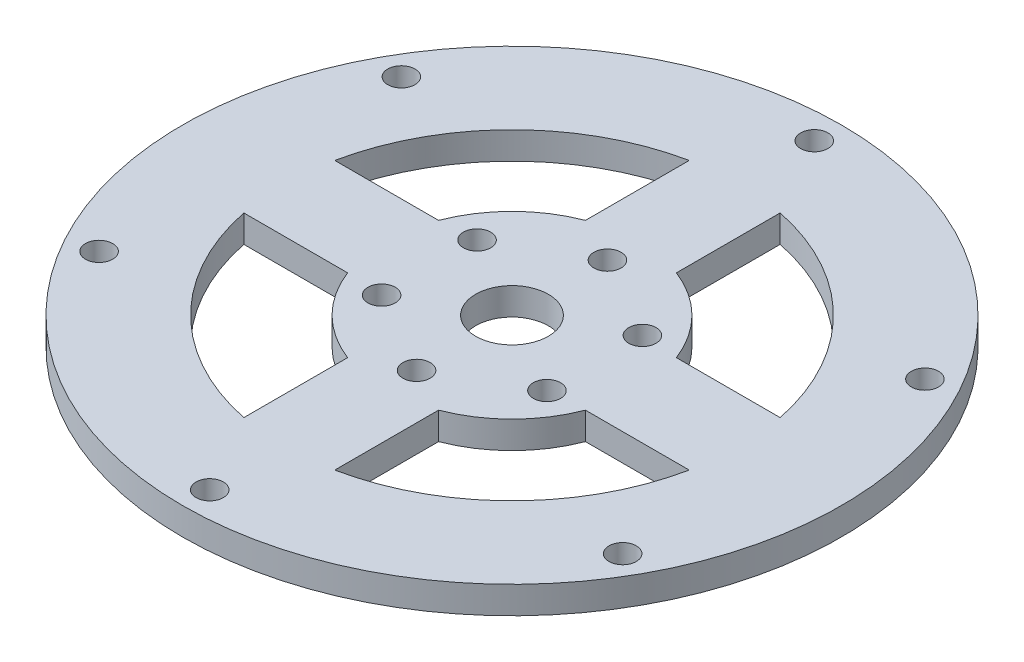
ISO-10303-21;
HEADER;
FILE_DESCRIPTION(('STEP AP214'),'2;1');
FILE_NAME('part.step','',(''),(''),'','','');
FILE_SCHEMA(('AUTOMOTIVE_DESIGN { 1 0 10303 214 1 1 1 1 }'));
ENDSEC;
DATA;
#1=APPLICATION_CONTEXT('core data for automotive mechanical design processes');
#2=APPLICATION_PROTOCOL_DEFINITION('international standard','automotive_design',2000,#1);
#3=PRODUCT_CONTEXT('',#1,'mechanical');
#4=PRODUCT('Part','Part','',(#3));
#5=PRODUCT_RELATED_PRODUCT_CATEGORY('part','',(#4));
#6=PRODUCT_DEFINITION_FORMATION('','',#4);
#7=PRODUCT_DEFINITION_CONTEXT('part definition',#1,'design');
#8=PRODUCT_DEFINITION('design','',#6,#7);
#9=PRODUCT_DEFINITION_SHAPE('','',#8);
#10=(LENGTH_UNIT() NAMED_UNIT(*) SI_UNIT(.MILLI.,.METRE.));
#11=(NAMED_UNIT(*) PLANE_ANGLE_UNIT() SI_UNIT($,.RADIAN.));
#12=(NAMED_UNIT(*) SI_UNIT($,.STERADIAN.) SOLID_ANGLE_UNIT());
#13=UNCERTAINTY_MEASURE_WITH_UNIT(LENGTH_MEASURE(1.E-05),#10,'distance_accuracy_value','');
#14=(GEOMETRIC_REPRESENTATION_CONTEXT(3) GLOBAL_UNCERTAINTY_ASSIGNED_CONTEXT((#13)) GLOBAL_UNIT_ASSIGNED_CONTEXT((#10,
#11,#12)) REPRESENTATION_CONTEXT('',''));
#15=CARTESIAN_POINT('',(0.,0.,0.));
#16=DIRECTION('',(0.,0.,1.));
#17=DIRECTION('',(1.,0.,0.));
#18=AXIS2_PLACEMENT_3D('',#15,#16,#17);
#19=CARTESIAN_POINT('',(0.,3.,0.));
#20=DIRECTION('',(0.,1.,0.));
#21=DIRECTION('',(0.,0.,1.));
#22=AXIS2_PLACEMENT_3D('',#19,#20,#21);
#23=PLANE('',#22);
#24=CARTESIAN_POINT('',(-9.09326673973655,3.,-5.25000000000011));
#25=DIRECTION('',(0.,1.,0.));
#26=DIRECTION('',(0.866025403784433,0.,0.50000000000001));
#27=AXIS2_PLACEMENT_3D('',#24,#25,#26);
#28=CIRCLE('',#27,1.5);
#29=CARTESIAN_POINT('',(-7.7942286340599,3.,-4.50000000000009));
#30=VERTEX_POINT('',#29);
#31=EDGE_CURVE('E705',#30,#30,#28,.T.);
#32=ORIENTED_EDGE('',*,*,#31,.F.);
#33=EDGE_LOOP('',(#32));
#34=FACE_BOUND('',#33,.T.);
#35=CARTESIAN_POINT('',(-9.09326673973665,3.,5.24999999999992));
#36=DIRECTION('',(0.,1.,0.));
#37=DIRECTION('',(0.866025403784443,0.,-0.499999999999992));
#38=AXIS2_PLACEMENT_3D('',#35,#36,#37);
#39=CIRCLE('',#38,1.5);
#40=CARTESIAN_POINT('',(-7.79422863405999,3.,4.49999999999993));
#41=VERTEX_POINT('',#40);
#42=EDGE_CURVE('E707',#41,#41,#39,.T.);
#43=ORIENTED_EDGE('',*,*,#42,.F.);
#44=EDGE_LOOP('',(#43));
#45=FACE_BOUND('',#44,.T.);
#46=CARTESIAN_POINT('',(0.,3.,10.5));
#47=DIRECTION('',(0.,1.,0.));
#48=DIRECTION('',(0.,0.,-1.));
#49=AXIS2_PLACEMENT_3D('',#46,#47,#48);
#50=CIRCLE('',#49,1.5);
#51=CARTESIAN_POINT('',(0.,3.,9.));
#52=VERTEX_POINT('',#51);
#53=EDGE_CURVE('E744',#52,#52,#50,.T.);
#54=ORIENTED_EDGE('',*,*,#53,.F.);
#55=EDGE_LOOP('',(#54));
#56=FACE_BOUND('',#55,.T.);
#57=CARTESIAN_POINT('',(9.09326673973658,3.,5.25000000000004));
#58=DIRECTION('',(0.,1.,0.));
#59=DIRECTION('',(-0.866025403784436,0.,-0.500000000000004));
#60=AXIS2_PLACEMENT_3D('',#57,#58,#59);
#61=CIRCLE('',#60,1.5);
#62=CARTESIAN_POINT('',(7.79422863405993,3.,4.50000000000004));
#63=VERTEX_POINT('',#62);
#64=EDGE_CURVE('E738',#63,#63,#61,.T.);
#65=ORIENTED_EDGE('',*,*,#64,.F.);
#66=EDGE_LOOP('',(#65));
#67=FACE_BOUND('',#66,.T.);
#68=CARTESIAN_POINT('',(9.09326673973662,3.,-5.24999999999998));
#69=DIRECTION('',(0.,1.,0.));
#70=DIRECTION('',(-0.86602540378444,0.,0.499999999999998));
#71=AXIS2_PLACEMENT_3D('',#68,#69,#70);
#72=CIRCLE('',#71,1.5);
#73=CARTESIAN_POINT('',(7.79422863405996,3.,-4.49999999999998));
#74=VERTEX_POINT('',#73);
#75=EDGE_CURVE('E713',#74,#74,#72,.T.);
#76=ORIENTED_EDGE('',*,*,#75,.F.);
#77=EDGE_LOOP('',(#76));
#78=FACE_BOUND('',#77,.T.);
#79=CARTESIAN_POINT('',(0.,3.,-10.5));
#80=DIRECTION('',(0.,1.,0.));
#81=DIRECTION('',(0.,0.,1.));
#82=AXIS2_PLACEMENT_3D('',#79,#80,#81);
#83=CIRCLE('',#82,1.5);
#84=CARTESIAN_POINT('',(0.,3.,-9.));
#85=VERTEX_POINT('',#84);
#86=EDGE_CURVE('E712',#85,#85,#83,.T.);
#87=ORIENTED_EDGE('',*,*,#86,.F.);
#88=EDGE_LOOP('',(#87));
#89=FACE_BOUND('',#88,.T.);
#90=CARTESIAN_POINT('',(-28.7953446758324,3.,-16.6250000000003));
#91=DIRECTION('',(0.,1.,0.));
#92=DIRECTION('',(0.,0.,1.));
#93=AXIS2_PLACEMENT_3D('',#90,#91,#92);
#94=CIRCLE('',#93,1.50000000000001);
#95=CARTESIAN_POINT('',(-28.7953446758324,3.,-15.1250000000003));
#96=VERTEX_POINT('',#95);
#97=EDGE_CURVE('E213',#96,#96,#94,.T.);
#98=ORIENTED_EDGE('',*,*,#97,.F.);
#99=EDGE_LOOP('',(#98));
#100=FACE_BOUND('',#99,.T.);
#101=CARTESIAN_POINT('',(-28.7953446758327,3.,16.6249999999997));
#102=DIRECTION('',(0.,1.,0.));
#103=DIRECTION('',(0.,0.,1.));
#104=AXIS2_PLACEMENT_3D('',#101,#102,#103);
#105=CIRCLE('',#104,1.50000000000001);
#106=CARTESIAN_POINT('',(-28.7953446758327,3.,18.1249999999997));
#107=VERTEX_POINT('',#106);
#108=EDGE_CURVE('E436',#107,#107,#105,.T.);
#109=ORIENTED_EDGE('',*,*,#108,.F.);
#110=EDGE_LOOP('',(#109));
#111=FACE_BOUND('',#110,.T.);
#112=CARTESIAN_POINT('',(0.,3.,33.25));
#113=DIRECTION('',(0.,1.,0.));
#114=DIRECTION('',(0.,0.,1.));
#115=AXIS2_PLACEMENT_3D('',#112,#113,#114);
#116=CIRCLE('',#115,1.50000000000001);
#117=CARTESIAN_POINT('',(0.,3.,34.75));
#118=VERTEX_POINT('',#117);
#119=EDGE_CURVE('E433',#118,#118,#116,.T.);
#120=ORIENTED_EDGE('',*,*,#119,.F.);
#121=EDGE_LOOP('',(#120));
#122=FACE_BOUND('',#121,.T.);
#123=CARTESIAN_POINT('',(28.7953446758325,3.,16.6250000000001));
#124=DIRECTION('',(0.,1.,0.));
#125=DIRECTION('',(0.,0.,1.));
#126=AXIS2_PLACEMENT_3D('',#123,#124,#125);
#127=CIRCLE('',#126,1.50000000000001);
#128=CARTESIAN_POINT('',(28.7953446758325,3.,18.1250000000001));
#129=VERTEX_POINT('',#128);
#130=EDGE_CURVE('E425',#129,#129,#127,.T.);
#131=ORIENTED_EDGE('',*,*,#130,.F.);
#132=EDGE_LOOP('',(#131));
#133=FACE_BOUND('',#132,.T.);
#134=CARTESIAN_POINT('',(28.7953446758326,3.,-16.6249999999999));
#135=DIRECTION('',(0.,1.,0.));
#136=DIRECTION('',(0.,0.,1.));
#137=AXIS2_PLACEMENT_3D('',#134,#135,#136);
#138=CIRCLE('',#137,1.50000000000001);
#139=CARTESIAN_POINT('',(28.7953446758326,3.,-15.1249999999999));
#140=VERTEX_POINT('',#139);
#141=EDGE_CURVE('E422',#140,#140,#138,.T.);
#142=ORIENTED_EDGE('',*,*,#141,.F.);
#143=EDGE_LOOP('',(#142));
#144=FACE_BOUND('',#143,.T.);
#145=CARTESIAN_POINT('',(0.,3.,0.));
#146=DIRECTION('',(0.,1.,0.));
#147=DIRECTION('',(0.,0.,1.));
#148=AXIS2_PLACEMENT_3D('',#145,#146,#147);
#149=CIRCLE('',#148,25.0000000000001);
#150=CARTESIAN_POINT('',(-24.4948974278318,3.,4.99999999999974));
#151=VERTEX_POINT('',#150);
#152=CARTESIAN_POINT('',(-4.9999999999996,3.,24.4948974278321));
#153=VERTEX_POINT('',#152);
#154=EDGE_CURVE('E49',#151,#153,#149,.T.);
#155=ORIENTED_EDGE('',*,*,#154,.F.);
#156=DIRECTION('',(1.,0.,0.));
#157=VECTOR('',#156,1.);
#158=CARTESIAN_POINT('',(-24.4948974278318,3.,4.99999999999974));
#159=LINE('',#158,#157);
#160=CARTESIAN_POINT('',(-13.076696830622,3.,5.));
#161=VERTEX_POINT('',#160);
#162=EDGE_CURVE('E206',#151,#161,#159,.T.);
#163=ORIENTED_EDGE('',*,*,#162,.T.);
#164=CARTESIAN_POINT('',(0.,3.,0.));
#165=DIRECTION('',(0.,1.,0.));
#166=DIRECTION('',(0.,0.,1.));
#167=AXIS2_PLACEMENT_3D('',#164,#165,#166);
#168=CIRCLE('',#167,14.);
#169=CARTESIAN_POINT('',(-5.,3.,13.076696830622));
#170=VERTEX_POINT('',#169);
#171=EDGE_CURVE('E216',#161,#170,#168,.T.);
#172=ORIENTED_EDGE('',*,*,#171,.T.);
#173=DIRECTION('',(0.,0.,-1.));
#174=VECTOR('',#173,1.);
#175=CARTESIAN_POINT('',(-4.9999999999996,3.,24.4948974278321));
#176=LINE('',#175,#174);
#177=EDGE_CURVE('E219',#153,#170,#176,.T.);
#178=ORIENTED_EDGE('',*,*,#177,.F.);
#179=EDGE_LOOP('',(#155,#163,#172,#178));
#180=FACE_BOUND('',#179,.T.);
#181=CARTESIAN_POINT('',(0.,3.,0.));
#182=DIRECTION('',(0.,1.,0.));
#183=DIRECTION('',(0.,0.,1.));
#184=AXIS2_PLACEMENT_3D('',#181,#182,#183);
#185=CIRCLE('',#184,4.);
#186=CARTESIAN_POINT('',(0.,3.,4.));
#187=VERTEX_POINT('',#186);
#188=EDGE_CURVE('E192',#187,#187,#185,.T.);
#189=ORIENTED_EDGE('',*,*,#188,.F.);
#190=EDGE_LOOP('',(#189));
#191=FACE_BOUND('',#190,.T.);
#192=CARTESIAN_POINT('',(0.,3.,0.));
#193=DIRECTION('',(0.,1.,0.));
#194=DIRECTION('',(0.,0.,1.));
#195=AXIS2_PLACEMENT_3D('',#192,#193,#194);
#196=CIRCLE('',#195,25.);
#197=CARTESIAN_POINT('',(4.99999999999983,3.,24.4948974278318));
#198=VERTEX_POINT('',#197);
#199=CARTESIAN_POINT('',(24.4948974278318,3.,5.00000000000009));
#200=VERTEX_POINT('',#199);
#201=EDGE_CURVE('E57',#198,#200,#196,.T.);
#202=ORIENTED_EDGE('',*,*,#201,.F.);
#203=DIRECTION('',(0.,0.,-1.));
#204=VECTOR('',#203,1.);
#205=CARTESIAN_POINT('',(4.99999999999983,3.,24.4948974278318));
#206=LINE('',#205,#204);
#207=CARTESIAN_POINT('',(5.,3.,13.076696830622));
#208=VERTEX_POINT('',#207);
#209=EDGE_CURVE('E185',#198,#208,#206,.T.);
#210=ORIENTED_EDGE('',*,*,#209,.T.);
#211=CARTESIAN_POINT('',(0.,3.,0.));
#212=DIRECTION('',(0.,1.,0.));
#213=DIRECTION('',(0.,0.,1.));
#214=AXIS2_PLACEMENT_3D('',#211,#212,#213);
#215=CIRCLE('',#214,14.);
#216=CARTESIAN_POINT('',(13.076696830622,3.,5.));
#217=VERTEX_POINT('',#216);
#218=EDGE_CURVE('E195',#208,#217,#215,.T.);
#219=ORIENTED_EDGE('',*,*,#218,.T.);
#220=DIRECTION('',(-1.,0.,0.));
#221=VECTOR('',#220,1.);
#222=CARTESIAN_POINT('',(24.4948974278318,3.,5.00000000000009));
#223=LINE('',#222,#221);
#224=EDGE_CURVE('E198',#200,#217,#223,.T.);
#225=ORIENTED_EDGE('',*,*,#224,.F.);
#226=EDGE_LOOP('',(#202,#210,#219,#225));
#227=FACE_BOUND('',#226,.T.);
#228=CARTESIAN_POINT('',(0.,3.,0.));
#229=DIRECTION('',(0.,1.,0.));
#230=DIRECTION('',(0.,0.,1.));
#231=AXIS2_PLACEMENT_3D('',#228,#229,#230);
#232=CIRCLE('',#231,25.);
#233=CARTESIAN_POINT('',(24.4948974278318,3.,-4.99999999999991));
#234=VERTEX_POINT('',#233);
#235=CARTESIAN_POINT('',(5.,3.,-24.4948974278318));
#236=VERTEX_POINT('',#235);
#237=EDGE_CURVE('E153',#234,#236,#232,.T.);
#238=ORIENTED_EDGE('',*,*,#237,.F.);
#239=DIRECTION('',(-1.,0.,0.));
#240=VECTOR('',#239,1.);
#241=CARTESIAN_POINT('',(24.4948974278318,3.,-4.99999999999991));
#242=LINE('',#241,#240);
#243=CARTESIAN_POINT('',(13.076696830622,3.,-5.));
#244=VERTEX_POINT('',#243);
#245=EDGE_CURVE('E162',#234,#244,#242,.T.);
#246=ORIENTED_EDGE('',*,*,#245,.T.);
#247=CARTESIAN_POINT('',(0.,3.,0.));
#248=DIRECTION('',(0.,1.,0.));
#249=DIRECTION('',(0.,0.,1.));
#250=AXIS2_PLACEMENT_3D('',#247,#248,#249);
#251=CIRCLE('',#250,14.);
#252=CARTESIAN_POINT('',(5.,3.,-13.076696830622));
#253=VERTEX_POINT('',#252);
#254=EDGE_CURVE('E168',#244,#253,#251,.T.);
#255=ORIENTED_EDGE('',*,*,#254,.T.);
#256=DIRECTION('',(0.,0.,1.));
#257=VECTOR('',#256,1.);
#258=CARTESIAN_POINT('',(5.,3.,-24.4948974278318));
#259=LINE('',#258,#257);
#260=EDGE_CURVE('E174',#236,#253,#259,.T.);
#261=ORIENTED_EDGE('',*,*,#260,.F.);
#262=EDGE_LOOP('',(#238,#246,#255,#261));
#263=FACE_BOUND('',#262,.T.);
#264=CARTESIAN_POINT('',(0.,3.,-33.25));
#265=DIRECTION('',(0.,1.,0.));
#266=DIRECTION('',(0.,0.,1.));
#267=AXIS2_PLACEMENT_3D('',#264,#265,#266);
#268=CIRCLE('',#267,1.50000000000001);
#269=CARTESIAN_POINT('',(0.,3.,-31.75));
#270=VERTEX_POINT('',#269);
#271=EDGE_CURVE('E244',#270,#270,#268,.T.);
#272=ORIENTED_EDGE('',*,*,#271,.F.);
#273=EDGE_LOOP('',(#272));
#274=FACE_BOUND('',#273,.T.);
#275=CARTESIAN_POINT('',(0.,3.,0.));
#276=DIRECTION('',(0.,1.,0.));
#277=DIRECTION('',(0.,0.,1.));
#278=AXIS2_PLACEMENT_3D('',#275,#276,#277);
#279=CIRCLE('',#278,36.25);
#280=CARTESIAN_POINT('',(0.,3.,36.25));
#281=VERTEX_POINT('',#280);
#282=EDGE_CURVE('E248',#281,#281,#279,.T.);
#283=ORIENTED_EDGE('',*,*,#282,.T.);
#284=EDGE_LOOP('',(#283));
#285=FACE_BOUND('',#284,.T.);
#286=CARTESIAN_POINT('',(0.,3.,0.));
#287=DIRECTION('',(0.,1.,0.));
#288=DIRECTION('',(0.,0.,1.));
#289=AXIS2_PLACEMENT_3D('',#286,#287,#288);
#290=CIRCLE('',#289,25.);
#291=CARTESIAN_POINT('',(-5.,3.,-24.4948974278318));
#292=VERTEX_POINT('',#291);
#293=CARTESIAN_POINT('',(-24.4948974278317,3.,-5.00000000000026));
#294=VERTEX_POINT('',#293);
#295=EDGE_CURVE('E178',#292,#294,#290,.T.);
#296=ORIENTED_EDGE('',*,*,#295,.F.);
#297=DIRECTION('',(0.,0.,1.));
#298=VECTOR('',#297,1.);
#299=CARTESIAN_POINT('',(-5.,3.,0.));
#300=LINE('',#299,#298);
#301=CARTESIAN_POINT('',(-5.,3.,-13.076696830622));
#302=VERTEX_POINT('',#301);
#303=EDGE_CURVE('E175',#292,#302,#300,.T.);
#304=ORIENTED_EDGE('',*,*,#303,.T.);
#305=CARTESIAN_POINT('',(0.,3.,0.));
#306=DIRECTION('',(0.,1.,0.));
#307=DIRECTION('',(0.,0.,1.));
#308=AXIS2_PLACEMENT_3D('',#305,#306,#307);
#309=CIRCLE('',#308,14.);
#310=CARTESIAN_POINT('',(-13.076696830622,3.,-5.));
#311=VERTEX_POINT('',#310);
#312=EDGE_CURVE('E228',#302,#311,#309,.T.);
#313=ORIENTED_EDGE('',*,*,#312,.T.);
#314=DIRECTION('',(1.,0.,0.));
#315=VECTOR('',#314,1.);
#316=CARTESIAN_POINT('',(1.14704257751652E-13,3.,-4.9999999999997));
#317=LINE('',#316,#315);
#318=EDGE_CURVE('E225',#294,#311,#317,.T.);
#319=ORIENTED_EDGE('',*,*,#318,.F.);
#320=EDGE_LOOP('',(#296,#304,#313,#319));
#321=FACE_BOUND('',#320,.T.);
#322=ADVANCED_FACE('F34',(#34,#45,#56,#67,#78,#89,#100,#111,#122,#133,#144,#180,#191,#227,#263,
#274,#285,#321),#23,.T.);
#323=CARTESIAN_POINT('',(0.,0.,0.));
#324=DIRECTION('',(0.,1.,0.));
#325=DIRECTION('',(0.,0.,1.));
#326=AXIS2_PLACEMENT_3D('',#323,#324,#325);
#327=PLANE('',#326);
#328=CARTESIAN_POINT('',(-9.09326673973655,0.,-5.25000000000011));
#329=DIRECTION('',(0.,1.,0.));
#330=DIRECTION('',(0.866025403784433,0.,0.50000000000001));
#331=AXIS2_PLACEMENT_3D('',#328,#329,#330);
#332=CIRCLE('',#331,1.5);
#333=CARTESIAN_POINT('',(-7.7942286340599,0.,-4.50000000000009));
#334=VERTEX_POINT('',#333);
#335=EDGE_CURVE('E381',#334,#334,#332,.T.);
#336=ORIENTED_EDGE('',*,*,#335,.T.);
#337=EDGE_LOOP('',(#336));
#338=FACE_BOUND('',#337,.T.);
#339=CARTESIAN_POINT('',(-9.09326673973665,0.,5.24999999999992));
#340=DIRECTION('',(0.,1.,0.));
#341=DIRECTION('',(0.866025403784443,0.,-0.499999999999992));
#342=AXIS2_PLACEMENT_3D('',#339,#340,#341);
#343=CIRCLE('',#342,1.5);
#344=CARTESIAN_POINT('',(-7.79422863405999,0.,4.49999999999993));
#345=VERTEX_POINT('',#344);
#346=EDGE_CURVE('E385',#345,#345,#343,.T.);
#347=ORIENTED_EDGE('',*,*,#346,.T.);
#348=EDGE_LOOP('',(#347));
#349=FACE_BOUND('',#348,.T.);
#350=CARTESIAN_POINT('',(0.,0.,10.5));
#351=DIRECTION('',(0.,1.,0.));
#352=DIRECTION('',(0.,0.,-1.));
#353=AXIS2_PLACEMENT_3D('',#350,#351,#352);
#354=CIRCLE('',#353,1.5);
#355=CARTESIAN_POINT('',(0.,0.,9.));
#356=VERTEX_POINT('',#355);
#357=EDGE_CURVE('E389',#356,#356,#354,.T.);
#358=ORIENTED_EDGE('',*,*,#357,.T.);
#359=EDGE_LOOP('',(#358));
#360=FACE_BOUND('',#359,.T.);
#361=CARTESIAN_POINT('',(9.09326673973658,0.,5.25000000000004));
#362=DIRECTION('',(0.,1.,0.));
#363=DIRECTION('',(-0.866025403784436,0.,-0.500000000000004));
#364=AXIS2_PLACEMENT_3D('',#361,#362,#363);
#365=CIRCLE('',#364,1.5);
#366=CARTESIAN_POINT('',(7.79422863405993,0.,4.50000000000004));
#367=VERTEX_POINT('',#366);
#368=EDGE_CURVE('E393',#367,#367,#365,.T.);
#369=ORIENTED_EDGE('',*,*,#368,.T.);
#370=EDGE_LOOP('',(#369));
#371=FACE_BOUND('',#370,.T.);
#372=CARTESIAN_POINT('',(9.09326673973662,0.,-5.24999999999998));
#373=DIRECTION('',(0.,1.,0.));
#374=DIRECTION('',(-0.86602540378444,0.,0.499999999999998));
#375=AXIS2_PLACEMENT_3D('',#372,#373,#374);
#376=CIRCLE('',#375,1.5);
#377=CARTESIAN_POINT('',(7.79422863405996,0.,-4.49999999999998));
#378=VERTEX_POINT('',#377);
#379=EDGE_CURVE('E397',#378,#378,#376,.T.);
#380=ORIENTED_EDGE('',*,*,#379,.T.);
#381=EDGE_LOOP('',(#380));
#382=FACE_BOUND('',#381,.T.);
#383=CARTESIAN_POINT('',(0.,0.,-10.5));
#384=DIRECTION('',(0.,1.,0.));
#385=DIRECTION('',(0.,0.,1.));
#386=AXIS2_PLACEMENT_3D('',#383,#384,#385);
#387=CIRCLE('',#386,1.5);
#388=CARTESIAN_POINT('',(0.,0.,-9.));
#389=VERTEX_POINT('',#388);
#390=EDGE_CURVE('E401',#389,#389,#387,.T.);
#391=ORIENTED_EDGE('',*,*,#390,.T.);
#392=EDGE_LOOP('',(#391));
#393=FACE_BOUND('',#392,.T.);
#394=CARTESIAN_POINT('',(-28.7953446758324,0.,-16.6250000000003));
#395=DIRECTION('',(0.,1.,0.));
#396=DIRECTION('',(0.866025403784433,0.,0.50000000000001));
#397=AXIS2_PLACEMENT_3D('',#394,#395,#396);
#398=CIRCLE('',#397,1.50000000000001);
#399=CARTESIAN_POINT('',(-27.4963065701557,0.,-15.8750000000003));
#400=VERTEX_POINT('',#399);
#401=EDGE_CURVE('E405',#400,#400,#398,.T.);
#402=ORIENTED_EDGE('',*,*,#401,.T.);
#403=EDGE_LOOP('',(#402));
#404=FACE_BOUND('',#403,.T.);
#405=CARTESIAN_POINT('',(-28.7953446758327,0.,16.6249999999997));
#406=DIRECTION('',(0.,1.,0.));
#407=DIRECTION('',(0.866025403784443,0.,-0.499999999999992));
#408=AXIS2_PLACEMENT_3D('',#405,#406,#407);
#409=CIRCLE('',#408,1.50000000000001);
#410=CARTESIAN_POINT('',(-27.4963065701561,0.,15.8749999999997));
#411=VERTEX_POINT('',#410);
#412=EDGE_CURVE('E409',#411,#411,#409,.T.);
#413=ORIENTED_EDGE('',*,*,#412,.T.);
#414=EDGE_LOOP('',(#413));
#415=FACE_BOUND('',#414,.T.);
#416=CARTESIAN_POINT('',(0.,0.,33.25));
#417=DIRECTION('',(0.,1.,0.));
#418=DIRECTION('',(0.,0.,-1.));
#419=AXIS2_PLACEMENT_3D('',#416,#417,#418);
#420=CIRCLE('',#419,1.50000000000001);
#421=CARTESIAN_POINT('',(0.,0.,31.75));
#422=VERTEX_POINT('',#421);
#423=EDGE_CURVE('E413',#422,#422,#420,.T.);
#424=ORIENTED_EDGE('',*,*,#423,.T.);
#425=EDGE_LOOP('',(#424));
#426=FACE_BOUND('',#425,.T.);
#427=CARTESIAN_POINT('',(28.7953446758325,0.,16.6250000000001));
#428=DIRECTION('',(0.,1.,0.));
#429=DIRECTION('',(-0.866025403784436,0.,-0.500000000000004));
#430=AXIS2_PLACEMENT_3D('',#427,#428,#429);
#431=CIRCLE('',#430,1.50000000000001);
#432=CARTESIAN_POINT('',(27.4963065701558,0.,15.8750000000001));
#433=VERTEX_POINT('',#432);
#434=EDGE_CURVE('E417',#433,#433,#431,.T.);
#435=ORIENTED_EDGE('',*,*,#434,.T.);
#436=EDGE_LOOP('',(#435));
#437=FACE_BOUND('',#436,.T.);
#438=CARTESIAN_POINT('',(28.7953446758326,0.,-16.6249999999999));
#439=DIRECTION('',(0.,1.,0.));
#440=DIRECTION('',(-0.86602540378444,0.,0.499999999999998));
#441=AXIS2_PLACEMENT_3D('',#438,#439,#440);
#442=CIRCLE('',#441,1.50000000000001);
#443=CARTESIAN_POINT('',(27.496306570156,0.,-15.8749999999999));
#444=VERTEX_POINT('',#443);
#445=EDGE_CURVE('E420',#444,#444,#442,.T.);
#446=ORIENTED_EDGE('',*,*,#445,.T.);
#447=EDGE_LOOP('',(#446));
#448=FACE_BOUND('',#447,.T.);
#449=DIRECTION('',(1.,0.,0.));
#450=VECTOR('',#449,1.);
#451=CARTESIAN_POINT('',(-1.1318499605959E-13,0.,5.0000000000003));
#452=LINE('',#451,#450);
#453=CARTESIAN_POINT('',(-24.4948974278318,0.,4.99999999999974));
#454=VERTEX_POINT('',#453);
#455=CARTESIAN_POINT('',(-13.076696830622,0.,5.));
#456=VERTEX_POINT('',#455);
#457=EDGE_CURVE('E42',#454,#456,#452,.T.);
#458=ORIENTED_EDGE('',*,*,#457,.F.);
#459=CARTESIAN_POINT('',(0.,0.,0.));
#460=DIRECTION('',(0.,1.,0.));
#461=DIRECTION('',(0.,0.,1.));
#462=AXIS2_PLACEMENT_3D('',#459,#460,#461);
#463=CIRCLE('',#462,25.0000000000001);
#464=CARTESIAN_POINT('',(-4.9999999999996,0.,24.4948974278321));
#465=VERTEX_POINT('',#464);
#466=EDGE_CURVE('E11',#454,#465,#463,.T.);
#467=ORIENTED_EDGE('',*,*,#466,.T.);
#468=DIRECTION('',(0.,0.,-1.));
#469=VECTOR('',#468,1.);
#470=CARTESIAN_POINT('',(-5.00000000000045,0.,1.72056386627499E-13));
#471=LINE('',#470,#469);
#472=CARTESIAN_POINT('',(-5.,0.,13.076696830622));
#473=VERTEX_POINT('',#472);
#474=EDGE_CURVE('E283',#465,#473,#471,.T.);
#475=ORIENTED_EDGE('',*,*,#474,.T.);
#476=CARTESIAN_POINT('',(0.,0.,0.));
#477=DIRECTION('',(0.,1.,0.));
#478=DIRECTION('',(0.,0.,1.));
#479=AXIS2_PLACEMENT_3D('',#476,#477,#478);
#480=CIRCLE('',#479,14.);
#481=EDGE_CURVE('E288',#456,#473,#480,.T.);
#482=ORIENTED_EDGE('',*,*,#481,.F.);
#483=EDGE_LOOP('',(#458,#467,#475,#482));
#484=FACE_BOUND('',#483,.T.);
#485=CARTESIAN_POINT('',(0.,0.,0.));
#486=DIRECTION('',(0.,1.,0.));
#487=DIRECTION('',(0.,0.,1.));
#488=AXIS2_PLACEMENT_3D('',#485,#486,#487);
#489=CIRCLE('',#488,4.);
#490=CARTESIAN_POINT('',(0.,0.,4.));
#491=VERTEX_POINT('',#490);
#492=EDGE_CURVE('E234',#491,#491,#489,.T.);
#493=ORIENTED_EDGE('',*,*,#492,.T.);
#494=EDGE_LOOP('',(#493));
#495=FACE_BOUND('',#494,.T.);
#496=DIRECTION('',(0.,0.,-1.));
#497=VECTOR('',#496,1.);
#498=CARTESIAN_POINT('',(5.00000000000019,0.,0.));
#499=LINE('',#498,#497);
#500=CARTESIAN_POINT('',(4.99999999999983,0.,24.4948974278318));
#501=VERTEX_POINT('',#500);
#502=CARTESIAN_POINT('',(5.,0.,13.076696830622));
#503=VERTEX_POINT('',#502);
#504=EDGE_CURVE('E278',#501,#503,#499,.T.);
#505=ORIENTED_EDGE('',*,*,#504,.F.);
#506=CARTESIAN_POINT('',(0.,0.,0.));
#507=DIRECTION('',(0.,1.,0.));
#508=DIRECTION('',(0.,0.,1.));
#509=AXIS2_PLACEMENT_3D('',#506,#507,#508);
#510=CIRCLE('',#509,25.);
#511=CARTESIAN_POINT('',(24.4948974278318,0.,5.00000000000009));
#512=VERTEX_POINT('',#511);
#513=EDGE_CURVE('E280',#501,#512,#510,.T.);
#514=ORIENTED_EDGE('',*,*,#513,.T.);
#515=DIRECTION('',(-1.,0.,0.));
#516=VECTOR('',#515,1.);
#517=CARTESIAN_POINT('',(0.,0.,4.9999999999999));
#518=LINE('',#517,#516);
#519=CARTESIAN_POINT('',(13.076696830622,0.,5.));
#520=VERTEX_POINT('',#519);
#521=EDGE_CURVE('E272',#512,#520,#518,.T.);
#522=ORIENTED_EDGE('',*,*,#521,.T.);
#523=CARTESIAN_POINT('',(0.,0.,0.));
#524=DIRECTION('',(0.,1.,0.));
#525=DIRECTION('',(0.,0.,1.));
#526=AXIS2_PLACEMENT_3D('',#523,#524,#525);
#527=CIRCLE('',#526,14.);
#528=EDGE_CURVE('E275',#503,#520,#527,.T.);
#529=ORIENTED_EDGE('',*,*,#528,.F.);
#530=EDGE_LOOP('',(#505,#514,#522,#529));
#531=FACE_BOUND('',#530,.T.);
#532=DIRECTION('',(-1.,0.,0.));
#533=VECTOR('',#532,1.);
#534=CARTESIAN_POINT('',(0.,0.,-5.0000000000001));
#535=LINE('',#534,#533);
#536=CARTESIAN_POINT('',(24.4948974278318,0.,-4.99999999999991));
#537=VERTEX_POINT('',#536);
#538=CARTESIAN_POINT('',(13.076696830622,0.,-5.));
#539=VERTEX_POINT('',#538);
#540=EDGE_CURVE('E269',#537,#539,#535,.T.);
#541=ORIENTED_EDGE('',*,*,#540,.F.);
#542=CARTESIAN_POINT('',(0.,0.,0.));
#543=DIRECTION('',(0.,1.,0.));
#544=DIRECTION('',(0.,0.,1.));
#545=AXIS2_PLACEMENT_3D('',#542,#543,#544);
#546=CIRCLE('',#545,25.);
#547=CARTESIAN_POINT('',(5.,0.,-24.4948974278318));
#548=VERTEX_POINT('',#547);
#549=EDGE_CURVE('E156',#537,#548,#546,.T.);
#550=ORIENTED_EDGE('',*,*,#549,.T.);
#551=DIRECTION('',(0.,0.,1.));
#552=VECTOR('',#551,1.);
#553=CARTESIAN_POINT('',(5.,0.,0.));
#554=LINE('',#553,#552);
#555=CARTESIAN_POINT('',(5.,0.,-13.076696830622));
#556=VERTEX_POINT('',#555);
#557=EDGE_CURVE('E263',#548,#556,#554,.T.);
#558=ORIENTED_EDGE('',*,*,#557,.T.);
#559=CARTESIAN_POINT('',(0.,0.,0.));
#560=DIRECTION('',(0.,1.,0.));
#561=DIRECTION('',(0.,0.,1.));
#562=AXIS2_PLACEMENT_3D('',#559,#560,#561);
#563=CIRCLE('',#562,14.);
#564=EDGE_CURVE('E266',#539,#556,#563,.T.);
#565=ORIENTED_EDGE('',*,*,#564,.F.);
#566=EDGE_LOOP('',(#541,#550,#558,#565));
#567=FACE_BOUND('',#566,.T.);
#568=CARTESIAN_POINT('',(0.,0.,0.));
#569=DIRECTION('',(0.,1.,0.));
#570=DIRECTION('',(0.,0.,1.));
#571=AXIS2_PLACEMENT_3D('',#568,#569,#570);
#572=CIRCLE('',#571,36.25);
#573=CARTESIAN_POINT('',(0.,0.,36.25));
#574=VERTEX_POINT('',#573);
#575=EDGE_CURVE('E247',#574,#574,#572,.T.);
#576=ORIENTED_EDGE('',*,*,#575,.F.);
#577=EDGE_LOOP('',(#576));
#578=FACE_BOUND('',#577,.T.);
#579=CARTESIAN_POINT('',(0.,0.,-33.25));
#580=DIRECTION('',(0.,1.,0.));
#581=DIRECTION('',(0.,0.,1.));
#582=AXIS2_PLACEMENT_3D('',#579,#580,#581);
#583=CIRCLE('',#582,1.50000000000001);
#584=CARTESIAN_POINT('',(0.,0.,-31.75));
#585=VERTEX_POINT('',#584);
#586=EDGE_CURVE('E241',#585,#585,#583,.T.);
#587=ORIENTED_EDGE('',*,*,#586,.T.);
#588=EDGE_LOOP('',(#587));
#589=FACE_BOUND('',#588,.T.);
#590=DIRECTION('',(0.,0.,1.));
#591=VECTOR('',#590,1.);
#592=CARTESIAN_POINT('',(-5.,0.,0.));
#593=LINE('',#592,#591);
#594=CARTESIAN_POINT('',(-5.,0.,-24.4948974278318));
#595=VERTEX_POINT('',#594);
#596=CARTESIAN_POINT('',(-5.,0.,-13.076696830622));
#597=VERTEX_POINT('',#596);
#598=EDGE_CURVE('E261',#595,#597,#593,.T.);
#599=ORIENTED_EDGE('',*,*,#598,.F.);
#600=CARTESIAN_POINT('',(0.,0.,0.));
#601=DIRECTION('',(0.,1.,0.));
#602=DIRECTION('',(0.,0.,1.));
#603=AXIS2_PLACEMENT_3D('',#600,#601,#602);
#604=CIRCLE('',#603,25.);
#605=CARTESIAN_POINT('',(-24.4948974278317,0.,-5.00000000000026));
#606=VERTEX_POINT('',#605);
#607=EDGE_CURVE('E251',#595,#606,#604,.T.);
#608=ORIENTED_EDGE('',*,*,#607,.T.);
#609=DIRECTION('',(1.,0.,0.));
#610=VECTOR('',#609,1.);
#611=CARTESIAN_POINT('',(1.14704257751652E-13,0.,-4.9999999999997));
#612=LINE('',#611,#610);
#613=CARTESIAN_POINT('',(-13.076696830622,0.,-5.));
#614=VERTEX_POINT('',#613);
#615=EDGE_CURVE('E256',#606,#614,#612,.T.);
#616=ORIENTED_EDGE('',*,*,#615,.T.);
#617=CARTESIAN_POINT('',(0.,0.,0.));
#618=DIRECTION('',(0.,1.,0.));
#619=DIRECTION('',(0.,0.,1.));
#620=AXIS2_PLACEMENT_3D('',#617,#618,#619);
#621=CIRCLE('',#620,14.);
#622=EDGE_CURVE('E259',#597,#614,#621,.T.);
#623=ORIENTED_EDGE('',*,*,#622,.F.);
#624=EDGE_LOOP('',(#599,#608,#616,#623));
#625=FACE_BOUND('',#624,.T.);
#626=ADVANCED_FACE('F301',(#338,#349,#360,#371,#382,#393,#404,#415,#426,#437,#448,#484,#495,
#531,#567,#578,#589,#625),#327,.F.);
#627=CARTESIAN_POINT('',(0.,3.,0.));
#628=DIRECTION('',(0.,-1.,0.));
#629=DIRECTION('',(0.,0.,-1.));
#630=AXIS2_PLACEMENT_3D('',#627,#628,#629);
#631=CYLINDRICAL_SURFACE('',#630,36.25);
#632=ORIENTED_EDGE('',*,*,#282,.F.);
#633=EDGE_LOOP('',(#632));
#634=FACE_BOUND('',#633,.T.);
#635=ORIENTED_EDGE('',*,*,#575,.T.);
#636=EDGE_LOOP('',(#635));
#637=FACE_BOUND('',#636,.T.);
#638=ADVANCED_FACE('F36',(#634,#637),#631,.T.);
#639=CARTESIAN_POINT('',(0.,0.,-33.25));
#640=DIRECTION('',(0.,1.,0.));
#641=DIRECTION('',(0.,0.,1.));
#642=AXIS2_PLACEMENT_3D('',#639,#640,#641);
#643=CYLINDRICAL_SURFACE('',#642,1.50000000000001);
#644=ORIENTED_EDGE('',*,*,#271,.T.);
#645=EDGE_LOOP('',(#644));
#646=FACE_BOUND('',#645,.T.);
#647=ORIENTED_EDGE('',*,*,#586,.F.);
#648=EDGE_LOOP('',(#647));
#649=FACE_BOUND('',#648,.T.);
#650=ADVANCED_FACE('F368',(#646,#649),#643,.F.);
#651=CARTESIAN_POINT('',(-5.,-5.,0.));
#652=DIRECTION('',(-1.,0.,0.));
#653=DIRECTION('',(0.,0.,1.));
#654=AXIS2_PLACEMENT_3D('',#651,#652,#653);
#655=PLANE('',#654);
#656=ORIENTED_EDGE('',*,*,#598,.T.);
#657=DIRECTION('',(0.,1.,0.));
#658=VECTOR('',#657,1.);
#659=CARTESIAN_POINT('',(-5.,-5.,-13.076696830622));
#660=LINE('',#659,#658);
#661=EDGE_CURVE('E232',#597,#302,#660,.T.);
#662=ORIENTED_EDGE('',*,*,#661,.T.);
#663=ORIENTED_EDGE('',*,*,#303,.F.);
#664=DIRECTION('',(0.,1.,0.));
#665=VECTOR('',#664,1.);
#666=CARTESIAN_POINT('',(-5.,-5.,-24.4948974278318));
#667=LINE('',#666,#665);
#668=EDGE_CURVE('E231',#595,#292,#667,.T.);
#669=ORIENTED_EDGE('',*,*,#668,.F.);
#670=EDGE_LOOP('',(#656,#662,#663,#669));
#671=FACE_BOUND('',#670,.T.);
#672=ADVANCED_FACE('F357',(#671),#655,.T.);
#673=CARTESIAN_POINT('',(0.,-5.,0.));
#674=DIRECTION('',(0.,1.,0.));
#675=DIRECTION('',(0.,0.,1.));
#676=AXIS2_PLACEMENT_3D('',#673,#674,#675);
#677=CYLINDRICAL_SURFACE('',#676,14.);
#678=ORIENTED_EDGE('',*,*,#622,.T.);
#679=DIRECTION('',(0.,1.,0.));
#680=VECTOR('',#679,1.);
#681=CARTESIAN_POINT('',(-13.076696830622,-5.,-5.));
#682=LINE('',#681,#680);
#683=EDGE_CURVE('E235',#614,#311,#682,.T.);
#684=ORIENTED_EDGE('',*,*,#683,.T.);
#685=ORIENTED_EDGE('',*,*,#312,.F.);
#686=ORIENTED_EDGE('',*,*,#661,.F.);
#687=EDGE_LOOP('',(#678,#684,#685,#686));
#688=FACE_BOUND('',#687,.T.);
#689=ADVANCED_FACE('F353',(#688),#677,.T.);
#690=CARTESIAN_POINT('',(1.14704257751652E-13,-5.,-4.9999999999997));
#691=DIRECTION('',(0.,0.,1.));
#692=DIRECTION('',(1.,0.,0.));
#693=AXIS2_PLACEMENT_3D('',#690,#691,#692);
#694=PLANE('',#693);
#695=DIRECTION('',(0.,1.,0.));
#696=VECTOR('',#695,1.);
#697=CARTESIAN_POINT('',(-24.4948974278317,-5.,-5.00000000000026));
#698=LINE('',#697,#696);
#699=EDGE_CURVE('E237',#606,#294,#698,.T.);
#700=ORIENTED_EDGE('',*,*,#699,.T.);
#701=ORIENTED_EDGE('',*,*,#318,.T.);
#702=ORIENTED_EDGE('',*,*,#683,.F.);
#703=ORIENTED_EDGE('',*,*,#615,.F.);
#704=EDGE_LOOP('',(#700,#701,#702,#703));
#705=FACE_BOUND('',#704,.T.);
#706=ADVANCED_FACE('F356',(#705),#694,.F.);
#707=CARTESIAN_POINT('',(0.,-5.,0.));
#708=DIRECTION('',(0.,1.,0.));
#709=DIRECTION('',(0.,0.,1.));
#710=AXIS2_PLACEMENT_3D('',#707,#708,#709);
#711=CYLINDRICAL_SURFACE('',#710,25.);
#712=ORIENTED_EDGE('',*,*,#668,.T.);
#713=ORIENTED_EDGE('',*,*,#295,.T.);
#714=ORIENTED_EDGE('',*,*,#699,.F.);
#715=ORIENTED_EDGE('',*,*,#607,.F.);
#716=EDGE_LOOP('',(#712,#713,#714,#715));
#717=FACE_BOUND('',#716,.T.);
#718=ADVANCED_FACE('F361',(#717),#711,.F.);
#719=CARTESIAN_POINT('',(0.,-5.,0.));
#720=DIRECTION('',(0.,1.,0.));
#721=DIRECTION('',(0.,0.,1.));
#722=AXIS2_PLACEMENT_3D('',#719,#720,#721);
#723=CYLINDRICAL_SURFACE('',#722,25.);
#724=DIRECTION('',(0.,1.,0.));
#725=VECTOR('',#724,1.);
#726=CARTESIAN_POINT('',(24.4948974278318,-5.,-4.99999999999991));
#727=LINE('',#726,#725);
#728=EDGE_CURVE('E148',#537,#234,#727,.T.);
#729=ORIENTED_EDGE('',*,*,#728,.T.);
#730=ORIENTED_EDGE('',*,*,#237,.T.);
#731=DIRECTION('',(0.,1.,0.));
#732=VECTOR('',#731,1.);
#733=CARTESIAN_POINT('',(5.,-5.,-24.4948974278318));
#734=LINE('',#733,#732);
#735=EDGE_CURVE('E169',#548,#236,#734,.T.);
#736=ORIENTED_EDGE('',*,*,#735,.F.);
#737=ORIENTED_EDGE('',*,*,#549,.F.);
#738=EDGE_LOOP('',(#729,#730,#736,#737));
#739=FACE_BOUND('',#738,.T.);
#740=ADVANCED_FACE('F150',(#739),#723,.F.);
#741=CARTESIAN_POINT('',(24.4948974278318,-5.,-4.99999999999991));
#742=DIRECTION('',(0.,0.,-1.));
#743=DIRECTION('',(-1.,0.,0.));
#744=AXIS2_PLACEMENT_3D('',#741,#742,#743);
#745=PLANE('',#744);
#746=ORIENTED_EDGE('',*,*,#540,.T.);
#747=DIRECTION('',(0.,1.,0.));
#748=VECTOR('',#747,1.);
#749=CARTESIAN_POINT('',(13.076696830622,-5.,-5.));
#750=LINE('',#749,#748);
#751=EDGE_CURVE('E159',#539,#244,#750,.T.);
#752=ORIENTED_EDGE('',*,*,#751,.T.);
#753=ORIENTED_EDGE('',*,*,#245,.F.);
#754=ORIENTED_EDGE('',*,*,#728,.F.);
#755=EDGE_LOOP('',(#746,#752,#753,#754));
#756=FACE_BOUND('',#755,.T.);
#757=ADVANCED_FACE('F163',(#756),#745,.T.);
#758=CARTESIAN_POINT('',(0.,-5.,0.));
#759=DIRECTION('',(0.,1.,0.));
#760=DIRECTION('',(0.,0.,1.));
#761=AXIS2_PLACEMENT_3D('',#758,#759,#760);
#762=CYLINDRICAL_SURFACE('',#761,14.);
#763=ORIENTED_EDGE('',*,*,#564,.T.);
#764=DIRECTION('',(0.,1.,0.));
#765=VECTOR('',#764,1.);
#766=CARTESIAN_POINT('',(5.,-5.,-13.076696830622));
#767=LINE('',#766,#765);
#768=EDGE_CURVE('E442',#556,#253,#767,.T.);
#769=ORIENTED_EDGE('',*,*,#768,.T.);
#770=ORIENTED_EDGE('',*,*,#254,.F.);
#771=ORIENTED_EDGE('',*,*,#751,.F.);
#772=EDGE_LOOP('',(#763,#769,#770,#771));
#773=FACE_BOUND('',#772,.T.);
#774=ADVANCED_FACE('F445',(#773),#762,.T.);
#775=CARTESIAN_POINT('',(5.,-5.,-24.4948974278318));
#776=DIRECTION('',(-1.,0.,0.));
#777=DIRECTION('',(0.,0.,1.));
#778=AXIS2_PLACEMENT_3D('',#775,#776,#777);
#779=PLANE('',#778);
#780=ORIENTED_EDGE('',*,*,#735,.T.);
#781=ORIENTED_EDGE('',*,*,#260,.T.);
#782=ORIENTED_EDGE('',*,*,#768,.F.);
#783=ORIENTED_EDGE('',*,*,#557,.F.);
#784=EDGE_LOOP('',(#780,#781,#782,#783));
#785=FACE_BOUND('',#784,.T.);
#786=ADVANCED_FACE('F448',(#785),#779,.F.);
#787=CARTESIAN_POINT('',(0.,-5.,0.));
#788=DIRECTION('',(0.,1.,0.));
#789=DIRECTION('',(0.,0.,1.));
#790=AXIS2_PLACEMENT_3D('',#787,#788,#789);
#791=CYLINDRICAL_SURFACE('',#790,25.);
#792=DIRECTION('',(0.,1.,0.));
#793=VECTOR('',#792,1.);
#794=CARTESIAN_POINT('',(4.99999999999983,-5.,24.4948974278318));
#795=LINE('',#794,#793);
#796=EDGE_CURVE('E190',#501,#198,#795,.T.);
#797=ORIENTED_EDGE('',*,*,#796,.T.);
#798=ORIENTED_EDGE('',*,*,#201,.T.);
#799=DIRECTION('',(0.,1.,0.));
#800=VECTOR('',#799,1.);
#801=CARTESIAN_POINT('',(24.4948974278318,-5.,5.00000000000009));
#802=LINE('',#801,#800);
#803=EDGE_CURVE('E183',#512,#200,#802,.T.);
#804=ORIENTED_EDGE('',*,*,#803,.F.);
#805=ORIENTED_EDGE('',*,*,#513,.F.);
#806=EDGE_LOOP('',(#797,#798,#804,#805));
#807=FACE_BOUND('',#806,.T.);
#808=ADVANCED_FACE('F319',(#807),#791,.F.);
#809=CARTESIAN_POINT('',(4.99999999999983,-5.,24.4948974278318));
#810=DIRECTION('',(1.,0.,0.));
#811=DIRECTION('',(0.,0.,-1.));
#812=AXIS2_PLACEMENT_3D('',#809,#810,#811);
#813=PLANE('',#812);
#814=ORIENTED_EDGE('',*,*,#504,.T.);
#815=DIRECTION('',(0.,1.,0.));
#816=VECTOR('',#815,1.);
#817=CARTESIAN_POINT('',(5.,-5.,13.076696830622));
#818=LINE('',#817,#816);
#819=EDGE_CURVE('E188',#503,#208,#818,.T.);
#820=ORIENTED_EDGE('',*,*,#819,.T.);
#821=ORIENTED_EDGE('',*,*,#209,.F.);
#822=ORIENTED_EDGE('',*,*,#796,.F.);
#823=EDGE_LOOP('',(#814,#820,#821,#822));
#824=FACE_BOUND('',#823,.T.);
#825=ADVANCED_FACE('F327',(#824),#813,.T.);
#826=CARTESIAN_POINT('',(0.,-5.,0.));
#827=DIRECTION('',(0.,1.,0.));
#828=DIRECTION('',(0.,0.,1.));
#829=AXIS2_PLACEMENT_3D('',#826,#827,#828);
#830=CYLINDRICAL_SURFACE('',#829,14.);
#831=ORIENTED_EDGE('',*,*,#528,.T.);
#832=DIRECTION('',(0.,1.,0.));
#833=VECTOR('',#832,1.);
#834=CARTESIAN_POINT('',(13.076696830622,-5.,5.));
#835=LINE('',#834,#833);
#836=EDGE_CURVE('E186',#520,#217,#835,.T.);
#837=ORIENTED_EDGE('',*,*,#836,.T.);
#838=ORIENTED_EDGE('',*,*,#218,.F.);
#839=ORIENTED_EDGE('',*,*,#819,.F.);
#840=EDGE_LOOP('',(#831,#837,#838,#839));
#841=FACE_BOUND('',#840,.T.);
#842=ADVANCED_FACE('F329',(#841),#830,.T.);
#843=CARTESIAN_POINT('',(24.4948974278318,-5.,5.00000000000009));
#844=DIRECTION('',(0.,0.,-1.));
#845=DIRECTION('',(-1.,0.,0.));
#846=AXIS2_PLACEMENT_3D('',#843,#844,#845);
#847=PLANE('',#846);
#848=ORIENTED_EDGE('',*,*,#803,.T.);
#849=ORIENTED_EDGE('',*,*,#224,.T.);
#850=ORIENTED_EDGE('',*,*,#836,.F.);
#851=ORIENTED_EDGE('',*,*,#521,.F.);
#852=EDGE_LOOP('',(#848,#849,#850,#851));
#853=FACE_BOUND('',#852,.T.);
#854=ADVANCED_FACE('F318',(#853),#847,.F.);
#855=CARTESIAN_POINT('',(0.,-5.,0.));
#856=DIRECTION('',(0.,1.,0.));
#857=DIRECTION('',(0.,0.,1.));
#858=AXIS2_PLACEMENT_3D('',#855,#856,#857);
#859=CYLINDRICAL_SURFACE('',#858,4.);
#860=ORIENTED_EDGE('',*,*,#188,.T.);
#861=EDGE_LOOP('',(#860));
#862=FACE_BOUND('',#861,.T.);
#863=ORIENTED_EDGE('',*,*,#492,.F.);
#864=EDGE_LOOP('',(#863));
#865=FACE_BOUND('',#864,.T.);
#866=ADVANCED_FACE('F336',(#862,#865),#859,.F.);
#867=CARTESIAN_POINT('',(0.,-5.,0.));
#868=DIRECTION('',(0.,1.,0.));
#869=DIRECTION('',(0.,0.,1.));
#870=AXIS2_PLACEMENT_3D('',#867,#868,#869);
#871=CYLINDRICAL_SURFACE('',#870,25.0000000000001);
#872=DIRECTION('',(0.,1.,0.));
#873=VECTOR('',#872,1.);
#874=CARTESIAN_POINT('',(-24.4948974278318,-5.,4.99999999999974));
#875=LINE('',#874,#873);
#876=EDGE_CURVE('E211',#454,#151,#875,.T.);
#877=ORIENTED_EDGE('',*,*,#876,.T.);
#878=ORIENTED_EDGE('',*,*,#154,.T.);
#879=DIRECTION('',(0.,1.,0.));
#880=VECTOR('',#879,1.);
#881=CARTESIAN_POINT('',(-4.9999999999996,-5.,24.4948974278321));
#882=LINE('',#881,#880);
#883=EDGE_CURVE('E204',#465,#153,#882,.T.);
#884=ORIENTED_EDGE('',*,*,#883,.F.);
#885=ORIENTED_EDGE('',*,*,#466,.F.);
#886=EDGE_LOOP('',(#877,#878,#884,#885));
#887=FACE_BOUND('',#886,.T.);
#888=ADVANCED_FACE('F306',(#887),#871,.F.);
#889=CARTESIAN_POINT('',(-24.4948974278318,-5.,4.99999999999974));
#890=DIRECTION('',(0.,0.,1.));
#891=DIRECTION('',(1.,0.,0.));
#892=AXIS2_PLACEMENT_3D('',#889,#890,#891);
#893=PLANE('',#892);
#894=ORIENTED_EDGE('',*,*,#457,.T.);
#895=DIRECTION('',(0.,1.,0.));
#896=VECTOR('',#895,1.);
#897=CARTESIAN_POINT('',(-13.076696830622,-5.,5.));
#898=LINE('',#897,#896);
#899=EDGE_CURVE('E209',#456,#161,#898,.T.);
#900=ORIENTED_EDGE('',*,*,#899,.T.);
#901=ORIENTED_EDGE('',*,*,#162,.F.);
#902=ORIENTED_EDGE('',*,*,#876,.F.);
#903=EDGE_LOOP('',(#894,#900,#901,#902));
#904=FACE_BOUND('',#903,.T.);
#905=ADVANCED_FACE('F294',(#904),#893,.T.);
#906=CARTESIAN_POINT('',(0.,-5.,0.));
#907=DIRECTION('',(0.,1.,0.));
#908=DIRECTION('',(0.,0.,1.));
#909=AXIS2_PLACEMENT_3D('',#906,#907,#908);
#910=CYLINDRICAL_SURFACE('',#909,14.);
#911=ORIENTED_EDGE('',*,*,#481,.T.);
#912=DIRECTION('',(0.,1.,0.));
#913=VECTOR('',#912,1.);
#914=CARTESIAN_POINT('',(-5.,-5.,13.076696830622));
#915=LINE('',#914,#913);
#916=EDGE_CURVE('E207',#473,#170,#915,.T.);
#917=ORIENTED_EDGE('',*,*,#916,.T.);
#918=ORIENTED_EDGE('',*,*,#171,.F.);
#919=ORIENTED_EDGE('',*,*,#899,.F.);
#920=EDGE_LOOP('',(#911,#917,#918,#919));
#921=FACE_BOUND('',#920,.T.);
#922=ADVANCED_FACE('F300',(#921),#910,.T.);
#923=CARTESIAN_POINT('',(-4.9999999999996,-5.,24.4948974278321));
#924=DIRECTION('',(1.,0.,0.));
#925=DIRECTION('',(0.,0.,-1.));
#926=AXIS2_PLACEMENT_3D('',#923,#924,#925);
#927=PLANE('',#926);
#928=ORIENTED_EDGE('',*,*,#883,.T.);
#929=ORIENTED_EDGE('',*,*,#177,.T.);
#930=ORIENTED_EDGE('',*,*,#916,.F.);
#931=ORIENTED_EDGE('',*,*,#474,.F.);
#932=EDGE_LOOP('',(#928,#929,#930,#931));
#933=FACE_BOUND('',#932,.T.);
#934=ADVANCED_FACE('F304',(#933),#927,.F.);
#935=CARTESIAN_POINT('',(28.7953446758326,0.,-16.6249999999999));
#936=DIRECTION('',(0.,1.,0.));
#937=DIRECTION('',(0.,0.,1.));
#938=AXIS2_PLACEMENT_3D('',#935,#936,#937);
#939=CYLINDRICAL_SURFACE('',#938,1.50000000000001);
#940=ORIENTED_EDGE('',*,*,#141,.T.);
#941=EDGE_LOOP('',(#940));
#942=FACE_BOUND('',#941,.T.);
#943=ORIENTED_EDGE('',*,*,#445,.F.);
#944=EDGE_LOOP('',(#943));
#945=FACE_BOUND('',#944,.T.);
#946=ADVANCED_FACE('F348',(#942,#945),#939,.F.);
#947=CARTESIAN_POINT('',(28.7953446758325,0.,16.6250000000001));
#948=DIRECTION('',(0.,1.,0.));
#949=DIRECTION('',(0.,0.,1.));
#950=AXIS2_PLACEMENT_3D('',#947,#948,#949);
#951=CYLINDRICAL_SURFACE('',#950,1.50000000000001);
#952=ORIENTED_EDGE('',*,*,#130,.T.);
#953=EDGE_LOOP('',(#952));
#954=FACE_BOUND('',#953,.T.);
#955=ORIENTED_EDGE('',*,*,#434,.F.);
#956=EDGE_LOOP('',(#955));
#957=FACE_BOUND('',#956,.T.);
#958=ADVANCED_FACE('F596',(#954,#957),#951,.F.);
#959=CARTESIAN_POINT('',(0.,0.,33.25));
#960=DIRECTION('',(0.,1.,0.));
#961=DIRECTION('',(0.,0.,1.));
#962=AXIS2_PLACEMENT_3D('',#959,#960,#961);
#963=CYLINDRICAL_SURFACE('',#962,1.50000000000001);
#964=ORIENTED_EDGE('',*,*,#119,.T.);
#965=EDGE_LOOP('',(#964));
#966=FACE_BOUND('',#965,.T.);
#967=ORIENTED_EDGE('',*,*,#423,.F.);
#968=EDGE_LOOP('',(#967));
#969=FACE_BOUND('',#968,.T.);
#970=ADVANCED_FACE('F604',(#966,#969),#963,.F.);
#971=CARTESIAN_POINT('',(-28.7953446758327,0.,16.6249999999997));
#972=DIRECTION('',(0.,1.,0.));
#973=DIRECTION('',(0.,0.,1.));
#974=AXIS2_PLACEMENT_3D('',#971,#972,#973);
#975=CYLINDRICAL_SURFACE('',#974,1.50000000000001);
#976=ORIENTED_EDGE('',*,*,#108,.T.);
#977=EDGE_LOOP('',(#976));
#978=FACE_BOUND('',#977,.T.);
#979=ORIENTED_EDGE('',*,*,#412,.F.);
#980=EDGE_LOOP('',(#979));
#981=FACE_BOUND('',#980,.T.);
#982=ADVANCED_FACE('F613',(#978,#981),#975,.F.);
#983=CARTESIAN_POINT('',(-28.7953446758324,0.,-16.6250000000003));
#984=DIRECTION('',(0.,1.,0.));
#985=DIRECTION('',(0.,0.,1.));
#986=AXIS2_PLACEMENT_3D('',#983,#984,#985);
#987=CYLINDRICAL_SURFACE('',#986,1.50000000000001);
#988=ORIENTED_EDGE('',*,*,#97,.T.);
#989=EDGE_LOOP('',(#988));
#990=FACE_BOUND('',#989,.T.);
#991=ORIENTED_EDGE('',*,*,#401,.F.);
#992=EDGE_LOOP('',(#991));
#993=FACE_BOUND('',#992,.T.);
#994=ADVANCED_FACE('F622',(#990,#993),#987,.F.);
#995=CARTESIAN_POINT('',(0.,0.,-10.5));
#996=DIRECTION('',(0.,1.,0.));
#997=DIRECTION('',(0.,0.,1.));
#998=AXIS2_PLACEMENT_3D('',#995,#996,#997);
#999=CYLINDRICAL_SURFACE('',#998,1.5);
#1000=ORIENTED_EDGE('',*,*,#390,.F.);
#1001=EDGE_LOOP('',(#1000));
#1002=FACE_BOUND('',#1001,.T.);
#1003=ORIENTED_EDGE('',*,*,#86,.T.);
#1004=EDGE_LOOP('',(#1003));
#1005=FACE_BOUND('',#1004,.T.);
#1006=ADVANCED_FACE('F631',(#1002,#1005),#999,.F.);
#1007=CARTESIAN_POINT('',(9.09326673973662,0.,-5.24999999999998));
#1008=DIRECTION('',(0.,1.,0.));
#1009=DIRECTION('',(0.,0.,1.));
#1010=AXIS2_PLACEMENT_3D('',#1007,#1008,#1009);
#1011=CYLINDRICAL_SURFACE('',#1010,1.5);
#1012=ORIENTED_EDGE('',*,*,#379,.F.);
#1013=EDGE_LOOP('',(#1012));
#1014=FACE_BOUND('',#1013,.T.);
#1015=ORIENTED_EDGE('',*,*,#75,.T.);
#1016=EDGE_LOOP('',(#1015));
#1017=FACE_BOUND('',#1016,.T.);
#1018=ADVANCED_FACE('F639',(#1014,#1017),#1011,.F.);
#1019=CARTESIAN_POINT('',(9.09326673973658,0.,5.25000000000004));
#1020=DIRECTION('',(0.,1.,0.));
#1021=DIRECTION('',(0.,0.,1.));
#1022=AXIS2_PLACEMENT_3D('',#1019,#1020,#1021);
#1023=CYLINDRICAL_SURFACE('',#1022,1.5);
#1024=ORIENTED_EDGE('',*,*,#368,.F.);
#1025=EDGE_LOOP('',(#1024));
#1026=FACE_BOUND('',#1025,.T.);
#1027=ORIENTED_EDGE('',*,*,#64,.T.);
#1028=EDGE_LOOP('',(#1027));
#1029=FACE_BOUND('',#1028,.T.);
#1030=ADVANCED_FACE('F647',(#1026,#1029),#1023,.F.);
#1031=CARTESIAN_POINT('',(0.,0.,10.5));
#1032=DIRECTION('',(0.,1.,0.));
#1033=DIRECTION('',(0.,0.,1.));
#1034=AXIS2_PLACEMENT_3D('',#1031,#1032,#1033);
#1035=CYLINDRICAL_SURFACE('',#1034,1.5);
#1036=ORIENTED_EDGE('',*,*,#357,.F.);
#1037=EDGE_LOOP('',(#1036));
#1038=FACE_BOUND('',#1037,.T.);
#1039=ORIENTED_EDGE('',*,*,#53,.T.);
#1040=EDGE_LOOP('',(#1039));
#1041=FACE_BOUND('',#1040,.T.);
#1042=ADVANCED_FACE('F656',(#1038,#1041),#1035,.F.);
#1043=CARTESIAN_POINT('',(-9.09326673973665,0.,5.24999999999992));
#1044=DIRECTION('',(0.,1.,0.));
#1045=DIRECTION('',(0.,0.,1.));
#1046=AXIS2_PLACEMENT_3D('',#1043,#1044,#1045);
#1047=CYLINDRICAL_SURFACE('',#1046,1.5);
#1048=ORIENTED_EDGE('',*,*,#346,.F.);
#1049=EDGE_LOOP('',(#1048));
#1050=FACE_BOUND('',#1049,.T.);
#1051=ORIENTED_EDGE('',*,*,#42,.T.);
#1052=EDGE_LOOP('',(#1051));
#1053=FACE_BOUND('',#1052,.T.);
#1054=ADVANCED_FACE('F665',(#1050,#1053),#1047,.F.);
#1055=CARTESIAN_POINT('',(-9.09326673973655,0.,-5.25000000000011));
#1056=DIRECTION('',(0.,1.,0.));
#1057=DIRECTION('',(0.,0.,1.));
#1058=AXIS2_PLACEMENT_3D('',#1055,#1056,#1057);
#1059=CYLINDRICAL_SURFACE('',#1058,1.5);
#1060=ORIENTED_EDGE('',*,*,#335,.F.);
#1061=EDGE_LOOP('',(#1060));
#1062=FACE_BOUND('',#1061,.T.);
#1063=ORIENTED_EDGE('',*,*,#31,.T.);
#1064=EDGE_LOOP('',(#1063));
#1065=FACE_BOUND('',#1064,.T.);
#1066=ADVANCED_FACE('F674',(#1062,#1065),#1059,.F.);
#1067=CLOSED_SHELL('',(#322,#626,#638,#650,#672,#689,#706,#718,#740,#757,#774,#786,#808,#825,
#842,#854,#866,#888,#905,#922,#934,#946,#958,#970,#982,#994,#1006,#1018,#1030,#1042,#1054,#1066));
#1068=MANIFOLD_SOLID_BREP('B2',#1067);
#1069=ADVANCED_BREP_SHAPE_REPRESENTATION('',(#18,#1068),#14);
#1070=SHAPE_DEFINITION_REPRESENTATION(#9,#1069);
ENDSEC;
END-ISO-10303-21;
